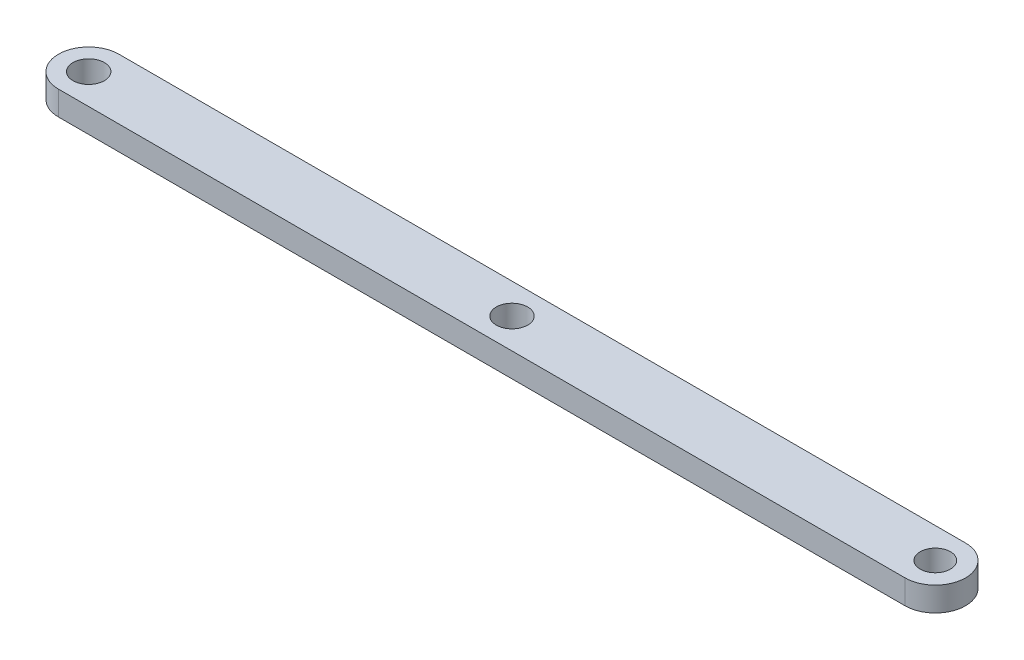
ISO-10303-21;
HEADER;
FILE_DESCRIPTION(('STEP AP214'),'2;1');
FILE_NAME('part.step','',(''),(''),'','','');
FILE_SCHEMA(('AUTOMOTIVE_DESIGN { 1 0 10303 214 1 1 1 1 }'));
ENDSEC;
DATA;
#1=APPLICATION_CONTEXT('core data for automotive mechanical design processes');
#2=APPLICATION_PROTOCOL_DEFINITION('international standard','automotive_design',2000,#1);
#3=PRODUCT_CONTEXT('',#1,'mechanical');
#4=PRODUCT('Part','Part','',(#3));
#5=PRODUCT_RELATED_PRODUCT_CATEGORY('part','',(#4));
#6=PRODUCT_DEFINITION_FORMATION('','',#4);
#7=PRODUCT_DEFINITION_CONTEXT('part definition',#1,'design');
#8=PRODUCT_DEFINITION('design','',#6,#7);
#9=PRODUCT_DEFINITION_SHAPE('','',#8);
#10=(LENGTH_UNIT() NAMED_UNIT(*) SI_UNIT(.MILLI.,.METRE.));
#11=(NAMED_UNIT(*) PLANE_ANGLE_UNIT() SI_UNIT($,.RADIAN.));
#12=(NAMED_UNIT(*) SI_UNIT($,.STERADIAN.) SOLID_ANGLE_UNIT());
#13=UNCERTAINTY_MEASURE_WITH_UNIT(LENGTH_MEASURE(1.E-05),#10,'distance_accuracy_value','');
#14=(GEOMETRIC_REPRESENTATION_CONTEXT(3) GLOBAL_UNCERTAINTY_ASSIGNED_CONTEXT((#13)) GLOBAL_UNIT_ASSIGNED_CONTEXT((#10,
#11,#12)) REPRESENTATION_CONTEXT('',''));
#15=CARTESIAN_POINT('',(0.,0.,0.));
#16=DIRECTION('',(0.,0.,1.));
#17=DIRECTION('',(1.,0.,0.));
#18=AXIS2_PLACEMENT_3D('',#15,#16,#17);
#19=CARTESIAN_POINT('',(-61.1673469387755,2.54,7.38673469387755));
#20=DIRECTION('',(0.,-1.,0.));
#21=DIRECTION('',(0.,0.,-1.));
#22=AXIS2_PLACEMENT_3D('',#19,#20,#21);
#23=CYLINDRICAL_SURFACE('',#22,3.175);
#24=CARTESIAN_POINT('',(-61.1673469387755,0.,7.38673469387755));
#25=DIRECTION('',(0.,1.,0.));
#26=DIRECTION('',(0.,0.,1.));
#27=AXIS2_PLACEMENT_3D('',#24,#25,#26);
#28=CIRCLE('',#27,3.175);
#29=CARTESIAN_POINT('',(-61.1673469387755,0.,4.21173469387755));
#30=VERTEX_POINT('',#29);
#31=CARTESIAN_POINT('',(-61.1673469387755,0.,10.5617346938775));
#32=VERTEX_POINT('',#31);
#33=EDGE_CURVE('E98',#30,#32,#28,.T.);
#34=ORIENTED_EDGE('',*,*,#33,.T.);
#35=DIRECTION('',(0.,-1.,0.));
#36=VECTOR('',#35,1.);
#37=CARTESIAN_POINT('',(-61.1673469387755,2.54,10.5617346938775));
#38=LINE('',#37,#36);
#39=CARTESIAN_POINT('',(-61.1673469387755,2.54,10.5617346938775));
#40=VERTEX_POINT('',#39);
#41=EDGE_CURVE('E11',#40,#32,#38,.T.);
#42=ORIENTED_EDGE('',*,*,#41,.F.);
#43=CARTESIAN_POINT('',(-61.1673469387755,2.54,7.38673469387755));
#44=DIRECTION('',(0.,1.,0.));
#45=DIRECTION('',(0.,0.,1.));
#46=AXIS2_PLACEMENT_3D('',#43,#44,#45);
#47=CIRCLE('',#46,3.175);
#48=CARTESIAN_POINT('',(-61.1673469387755,2.54,4.21173469387755));
#49=VERTEX_POINT('',#48);
#50=EDGE_CURVE('E84',#49,#40,#47,.T.);
#51=ORIENTED_EDGE('',*,*,#50,.F.);
#52=DIRECTION('',(0.,-1.,0.));
#53=VECTOR('',#52,1.);
#54=CARTESIAN_POINT('',(-61.1673469387755,2.54,4.21173469387755));
#55=LINE('',#54,#53);
#56=EDGE_CURVE('E51',#49,#30,#55,.T.);
#57=ORIENTED_EDGE('',*,*,#56,.T.);
#58=EDGE_LOOP('',(#34,#42,#51,#57));
#59=FACE_BOUND('',#58,.T.);
#60=ADVANCED_FACE('F35',(#59),#23,.T.);
#61=CARTESIAN_POINT('',(0.,2.54,10.5617346938775));
#62=DIRECTION('',(0.,0.,-1.));
#63=DIRECTION('',(-1.,0.,0.));
#64=AXIS2_PLACEMENT_3D('',#61,#62,#63);
#65=PLANE('',#64);
#66=DIRECTION('',(1.,0.,0.));
#67=VECTOR('',#66,1.);
#68=CARTESIAN_POINT('',(0.,0.,10.5617346938775));
#69=LINE('',#68,#67);
#70=CARTESIAN_POINT('',(27.7326530612245,0.,10.5617346938775));
#71=VERTEX_POINT('',#70);
#72=EDGE_CURVE('E89',#32,#71,#69,.T.);
#73=ORIENTED_EDGE('',*,*,#72,.T.);
#74=DIRECTION('',(0.,-1.,0.));
#75=VECTOR('',#74,1.);
#76=CARTESIAN_POINT('',(27.7326530612245,2.54,10.5617346938775));
#77=LINE('',#76,#75);
#78=CARTESIAN_POINT('',(27.7326530612245,2.54,10.5617346938775));
#79=VERTEX_POINT('',#78);
#80=EDGE_CURVE('E43',#79,#71,#77,.T.);
#81=ORIENTED_EDGE('',*,*,#80,.F.);
#82=DIRECTION('',(1.,0.,0.));
#83=VECTOR('',#82,1.);
#84=CARTESIAN_POINT('',(0.,2.54,10.5617346938775));
#85=LINE('',#84,#83);
#86=EDGE_CURVE('E77',#40,#79,#85,.T.);
#87=ORIENTED_EDGE('',*,*,#86,.F.);
#88=ORIENTED_EDGE('',*,*,#41,.T.);
#89=EDGE_LOOP('',(#73,#81,#87,#88));
#90=FACE_BOUND('',#89,.T.);
#91=ADVANCED_FACE('F88',(#90),#65,.F.);
#92=CARTESIAN_POINT('',(27.7326530612245,2.54,7.38673469387752));
#93=DIRECTION('',(0.,-1.,0.));
#94=DIRECTION('',(0.,0.,-1.));
#95=AXIS2_PLACEMENT_3D('',#92,#93,#94);
#96=CYLINDRICAL_SURFACE('',#95,3.17499999999998);
#97=CARTESIAN_POINT('',(27.7326530612245,0.,7.38673469387752));
#98=DIRECTION('',(0.,1.,0.));
#99=DIRECTION('',(0.,0.,1.));
#100=AXIS2_PLACEMENT_3D('',#97,#98,#99);
#101=CIRCLE('',#100,3.17499999999998);
#102=CARTESIAN_POINT('',(27.7326530612245,0.,4.2117346938775));
#103=VERTEX_POINT('',#102);
#104=EDGE_CURVE('E102',#71,#103,#101,.T.);
#105=ORIENTED_EDGE('',*,*,#104,.T.);
#106=DIRECTION('',(0.,-1.,0.));
#107=VECTOR('',#106,1.);
#108=CARTESIAN_POINT('',(27.7326530612245,2.54,4.2117346938775));
#109=LINE('',#108,#107);
#110=CARTESIAN_POINT('',(27.7326530612245,2.54,4.2117346938775));
#111=VERTEX_POINT('',#110);
#112=EDGE_CURVE('E66',#111,#103,#109,.T.);
#113=ORIENTED_EDGE('',*,*,#112,.F.);
#114=CARTESIAN_POINT('',(27.7326530612245,2.54,7.38673469387752));
#115=DIRECTION('',(0.,1.,0.));
#116=DIRECTION('',(0.,0.,1.));
#117=AXIS2_PLACEMENT_3D('',#114,#115,#116);
#118=CIRCLE('',#117,3.17499999999998);
#119=EDGE_CURVE('E83',#79,#111,#118,.T.);
#120=ORIENTED_EDGE('',*,*,#119,.F.);
#121=ORIENTED_EDGE('',*,*,#80,.T.);
#122=EDGE_LOOP('',(#105,#113,#120,#121));
#123=FACE_BOUND('',#122,.T.);
#124=ADVANCED_FACE('F92',(#123),#96,.T.);
#125=CARTESIAN_POINT('',(0.,2.54,4.21173469387751));
#126=DIRECTION('',(0.,0.,-1.));
#127=DIRECTION('',(-1.,0.,0.));
#128=AXIS2_PLACEMENT_3D('',#125,#126,#127);
#129=PLANE('',#128);
#130=DIRECTION('',(1.,0.,0.));
#131=VECTOR('',#130,1.);
#132=CARTESIAN_POINT('',(0.,0.,4.21173469387751));
#133=LINE('',#132,#131);
#134=EDGE_CURVE('E104',#30,#103,#133,.T.);
#135=ORIENTED_EDGE('',*,*,#134,.F.);
#136=ORIENTED_EDGE('',*,*,#56,.F.);
#137=DIRECTION('',(1.,0.,0.));
#138=VECTOR('',#137,1.);
#139=CARTESIAN_POINT('',(0.,2.54,4.21173469387751));
#140=LINE('',#139,#138);
#141=EDGE_CURVE('E93',#49,#111,#140,.T.);
#142=ORIENTED_EDGE('',*,*,#141,.T.);
#143=ORIENTED_EDGE('',*,*,#112,.T.);
#144=EDGE_LOOP('',(#135,#136,#142,#143));
#145=FACE_BOUND('',#144,.T.);
#146=ADVANCED_FACE('F140',(#145),#129,.T.);
#147=CARTESIAN_POINT('',(0.,2.54,0.));
#148=DIRECTION('',(0.,1.,0.));
#149=DIRECTION('',(0.,0.,1.));
#150=AXIS2_PLACEMENT_3D('',#147,#148,#149);
#151=PLANE('',#150);
#152=CARTESIAN_POINT('',(-16.7173469387755,2.54,7.38673469387757));
#153=DIRECTION('',(0.,1.,0.));
#154=DIRECTION('',(0.,0.,1.));
#155=AXIS2_PLACEMENT_3D('',#152,#153,#154);
#156=CIRCLE('',#155,1.651);
#157=CARTESIAN_POINT('',(-16.7173469387755,2.54,9.03773469387757));
#158=VERTEX_POINT('',#157);
#159=EDGE_CURVE('E122',#158,#158,#156,.T.);
#160=ORIENTED_EDGE('',*,*,#159,.F.);
#161=EDGE_LOOP('',(#160));
#162=FACE_BOUND('',#161,.T.);
#163=CARTESIAN_POINT('',(-61.1673469387755,2.54,7.38673469387755));
#164=DIRECTION('',(0.,1.,0.));
#165=DIRECTION('',(0.,0.,1.));
#166=AXIS2_PLACEMENT_3D('',#163,#164,#165);
#167=CIRCLE('',#166,1.651);
#168=CARTESIAN_POINT('',(-61.1673469387755,2.54,9.03773469387755));
#169=VERTEX_POINT('',#168);
#170=EDGE_CURVE('E117',#169,#169,#167,.T.);
#171=ORIENTED_EDGE('',*,*,#170,.F.);
#172=EDGE_LOOP('',(#171));
#173=FACE_BOUND('',#172,.T.);
#174=CARTESIAN_POINT('',(27.7326530612245,2.54,7.38673469387752));
#175=DIRECTION('',(0.,1.,0.));
#176=DIRECTION('',(0.,0.,1.));
#177=AXIS2_PLACEMENT_3D('',#174,#175,#176);
#178=CIRCLE('',#177,1.5875);
#179=CARTESIAN_POINT('',(27.7326530612245,2.54,8.97423469387752));
#180=VERTEX_POINT('',#179);
#181=EDGE_CURVE('E110',#180,#180,#178,.T.);
#182=ORIENTED_EDGE('',*,*,#181,.F.);
#183=EDGE_LOOP('',(#182));
#184=FACE_BOUND('',#183,.T.);
#185=ORIENTED_EDGE('',*,*,#50,.T.);
#186=ORIENTED_EDGE('',*,*,#86,.T.);
#187=ORIENTED_EDGE('',*,*,#119,.T.);
#188=ORIENTED_EDGE('',*,*,#141,.F.);
#189=EDGE_LOOP('',(#185,#186,#187,#188));
#190=FACE_BOUND('',#189,.T.);
#191=ADVANCED_FACE('F80',(#162,#173,#184,#190),#151,.T.);
#192=CARTESIAN_POINT('',(0.,0.,0.));
#193=DIRECTION('',(0.,1.,0.));
#194=DIRECTION('',(0.,0.,1.));
#195=AXIS2_PLACEMENT_3D('',#192,#193,#194);
#196=PLANE('',#195);
#197=CARTESIAN_POINT('',(-16.7173469387755,0.,7.38673469387757));
#198=DIRECTION('',(0.,1.,0.));
#199=DIRECTION('',(0.,0.,1.));
#200=AXIS2_PLACEMENT_3D('',#197,#198,#199);
#201=CIRCLE('',#200,1.651);
#202=CARTESIAN_POINT('',(-16.7173469387755,0.,9.03773469387757));
#203=VERTEX_POINT('',#202);
#204=EDGE_CURVE('E114',#203,#203,#201,.T.);
#205=ORIENTED_EDGE('',*,*,#204,.T.);
#206=EDGE_LOOP('',(#205));
#207=FACE_BOUND('',#206,.T.);
#208=CARTESIAN_POINT('',(-61.1673469387755,0.,7.38673469387755));
#209=DIRECTION('',(0.,1.,0.));
#210=DIRECTION('',(0.,0.,1.));
#211=AXIS2_PLACEMENT_3D('',#208,#209,#210);
#212=CIRCLE('',#211,1.651);
#213=CARTESIAN_POINT('',(-61.1673469387755,0.,9.03773469387755));
#214=VERTEX_POINT('',#213);
#215=EDGE_CURVE('E100',#214,#214,#212,.T.);
#216=ORIENTED_EDGE('',*,*,#215,.T.);
#217=EDGE_LOOP('',(#216));
#218=FACE_BOUND('',#217,.T.);
#219=CARTESIAN_POINT('',(27.7326530612245,0.,7.38673469387752));
#220=DIRECTION('',(0.,1.,0.));
#221=DIRECTION('',(0.,0.,1.));
#222=AXIS2_PLACEMENT_3D('',#219,#220,#221);
#223=CIRCLE('',#222,1.5875);
#224=CARTESIAN_POINT('',(27.7326530612245,0.,8.97423469387752));
#225=VERTEX_POINT('',#224);
#226=EDGE_CURVE('E113',#225,#225,#223,.T.);
#227=ORIENTED_EDGE('',*,*,#226,.T.);
#228=EDGE_LOOP('',(#227));
#229=FACE_BOUND('',#228,.T.);
#230=ORIENTED_EDGE('',*,*,#33,.F.);
#231=ORIENTED_EDGE('',*,*,#134,.T.);
#232=ORIENTED_EDGE('',*,*,#104,.F.);
#233=ORIENTED_EDGE('',*,*,#72,.F.);
#234=EDGE_LOOP('',(#230,#231,#232,#233));
#235=FACE_BOUND('',#234,.T.);
#236=ADVANCED_FACE('F128',(#207,#218,#229,#235),#196,.F.);
#237=CARTESIAN_POINT('',(27.7326530612245,0.,7.38673469387752));
#238=DIRECTION('',(0.,1.,0.));
#239=DIRECTION('',(0.,0.,1.));
#240=AXIS2_PLACEMENT_3D('',#237,#238,#239);
#241=CYLINDRICAL_SURFACE('',#240,1.5875);
#242=ORIENTED_EDGE('',*,*,#226,.F.);
#243=EDGE_LOOP('',(#242));
#244=FACE_BOUND('',#243,.T.);
#245=ORIENTED_EDGE('',*,*,#181,.T.);
#246=EDGE_LOOP('',(#245));
#247=FACE_BOUND('',#246,.T.);
#248=ADVANCED_FACE('F146',(#244,#247),#241,.F.);
#249=CARTESIAN_POINT('',(-61.1673469387755,0.,7.38673469387755));
#250=DIRECTION('',(0.,1.,0.));
#251=DIRECTION('',(0.,0.,1.));
#252=AXIS2_PLACEMENT_3D('',#249,#250,#251);
#253=CYLINDRICAL_SURFACE('',#252,1.651);
#254=ORIENTED_EDGE('',*,*,#215,.F.);
#255=EDGE_LOOP('',(#254));
#256=FACE_BOUND('',#255,.T.);
#257=ORIENTED_EDGE('',*,*,#170,.T.);
#258=EDGE_LOOP('',(#257));
#259=FACE_BOUND('',#258,.T.);
#260=ADVANCED_FACE('F134',(#256,#259),#253,.F.);
#261=CARTESIAN_POINT('',(-16.7173469387755,0.,7.38673469387757));
#262=DIRECTION('',(0.,1.,0.));
#263=DIRECTION('',(0.,0.,1.));
#264=AXIS2_PLACEMENT_3D('',#261,#262,#263);
#265=CYLINDRICAL_SURFACE('',#264,1.651);
#266=ORIENTED_EDGE('',*,*,#204,.F.);
#267=EDGE_LOOP('',(#266));
#268=FACE_BOUND('',#267,.T.);
#269=ORIENTED_EDGE('',*,*,#159,.T.);
#270=EDGE_LOOP('',(#269));
#271=FACE_BOUND('',#270,.T.);
#272=ADVANCED_FACE('F131',(#268,#271),#265,.F.);
#273=CLOSED_SHELL('',(#60,#91,#124,#146,#191,#236,#248,#260,#272));
#274=MANIFOLD_SOLID_BREP('B2',#273);
#275=ADVANCED_BREP_SHAPE_REPRESENTATION('',(#18,#274),#14);
#276=SHAPE_DEFINITION_REPRESENTATION(#9,#275);
ENDSEC;
END-ISO-10303-21;
